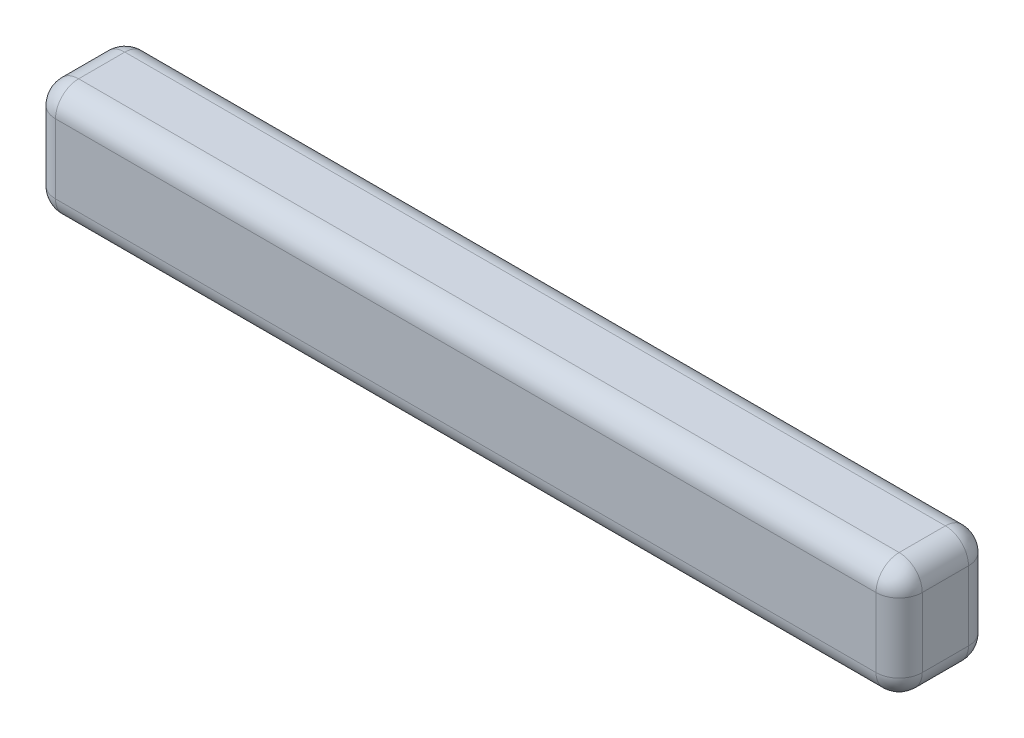
ISO-10303-21;
HEADER;
FILE_DESCRIPTION(('STEP AP214'),'2;1');
FILE_NAME('part.step','',(''),(''),'','','');
FILE_SCHEMA(('AUTOMOTIVE_DESIGN { 1 0 10303 214 1 1 1 1 }'));
ENDSEC;
DATA;
#1=APPLICATION_CONTEXT('core data for automotive mechanical design processes');
#2=APPLICATION_PROTOCOL_DEFINITION('international standard','automotive_design',2000,#1);
#3=PRODUCT_CONTEXT('',#1,'mechanical');
#4=PRODUCT('Part','Part','',(#3));
#5=PRODUCT_RELATED_PRODUCT_CATEGORY('part','',(#4));
#6=PRODUCT_DEFINITION_FORMATION('','',#4);
#7=PRODUCT_DEFINITION_CONTEXT('part definition',#1,'design');
#8=PRODUCT_DEFINITION('design','',#6,#7);
#9=PRODUCT_DEFINITION_SHAPE('','',#8);
#10=(LENGTH_UNIT() NAMED_UNIT(*) SI_UNIT(.MILLI.,.METRE.));
#11=(NAMED_UNIT(*) PLANE_ANGLE_UNIT() SI_UNIT($,.RADIAN.));
#12=(NAMED_UNIT(*) SI_UNIT($,.STERADIAN.) SOLID_ANGLE_UNIT());
#13=UNCERTAINTY_MEASURE_WITH_UNIT(LENGTH_MEASURE(1.E-05),#10,'distance_accuracy_value','');
#14=(GEOMETRIC_REPRESENTATION_CONTEXT(3) GLOBAL_UNCERTAINTY_ASSIGNED_CONTEXT((#13)) GLOBAL_UNIT_ASSIGNED_CONTEXT((#10,
#11,#12)) REPRESENTATION_CONTEXT('',''));
#15=CARTESIAN_POINT('',(0.,0.,0.));
#16=DIRECTION('',(0.,0.,1.));
#17=DIRECTION('',(1.,0.,0.));
#18=AXIS2_PLACEMENT_3D('',#15,#16,#17);
#19=CARTESIAN_POINT('',(18.75,5.,2.));
#20=DIRECTION('',(-1.,0.,0.));
#21=DIRECTION('',(0.,0.,1.));
#22=AXIS2_PLACEMENT_3D('',#19,#20,#21);
#23=PLANE('',#22);
#24=DIRECTION('',(0.,0.,-1.));
#25=VECTOR('',#24,1.);
#26=CARTESIAN_POINT('',(18.75,4.,2.));
#27=LINE('',#26,#25);
#28=CARTESIAN_POINT('',(18.75,4.,-1.));
#29=VERTEX_POINT('',#28);
#30=CARTESIAN_POINT('',(18.75,4.,1.));
#31=VERTEX_POINT('',#30);
#32=EDGE_CURVE('E41',#29,#31,#27,.F.);
#33=ORIENTED_EDGE('',*,*,#32,.T.);
#34=DIRECTION('',(0.,-1.,0.));
#35=VECTOR('',#34,1.);
#36=CARTESIAN_POINT('',(18.75,5.,1.));
#37=LINE('',#36,#35);
#38=CARTESIAN_POINT('',(18.75,1.,1.));
#39=VERTEX_POINT('',#38);
#40=EDGE_CURVE('E11',#31,#39,#37,.T.);
#41=ORIENTED_EDGE('',*,*,#40,.T.);
#42=DIRECTION('',(0.,0.,-1.));
#43=VECTOR('',#42,1.);
#44=CARTESIAN_POINT('',(18.75,1.,-2.));
#45=LINE('',#44,#43);
#46=CARTESIAN_POINT('',(18.75,1.,-1.));
#47=VERTEX_POINT('',#46);
#48=EDGE_CURVE('E193',#39,#47,#45,.T.);
#49=ORIENTED_EDGE('',*,*,#48,.T.);
#50=DIRECTION('',(0.,-1.,0.));
#51=VECTOR('',#50,1.);
#52=CARTESIAN_POINT('',(18.75,5.,-1.));
#53=LINE('',#52,#51);
#54=EDGE_CURVE('E52',#47,#29,#53,.F.);
#55=ORIENTED_EDGE('',*,*,#54,.T.);
#56=EDGE_LOOP('',(#33,#41,#49,#55));
#57=FACE_BOUND('',#56,.T.);
#58=ADVANCED_FACE('F32',(#57),#23,.F.);
#59=CARTESIAN_POINT('',(-18.75,5.,-2.));
#60=DIRECTION('',(0.,0.,1.));
#61=DIRECTION('',(1.,0.,0.));
#62=AXIS2_PLACEMENT_3D('',#59,#60,#61);
#63=PLANE('',#62);
#64=DIRECTION('',(0.,-1.,0.));
#65=VECTOR('',#64,1.);
#66=CARTESIAN_POINT('',(17.75,5.,-2.));
#67=LINE('',#66,#65);
#68=CARTESIAN_POINT('',(17.75,4.,-2.));
#69=VERTEX_POINT('',#68);
#70=CARTESIAN_POINT('',(17.75,1.,-2.));
#71=VERTEX_POINT('',#70);
#72=EDGE_CURVE('E157',#69,#71,#67,.T.);
#73=ORIENTED_EDGE('',*,*,#72,.T.);
#74=DIRECTION('',(-1.,0.,0.));
#75=VECTOR('',#74,1.);
#76=CARTESIAN_POINT('',(-18.75,1.,-2.));
#77=LINE('',#76,#75);
#78=CARTESIAN_POINT('',(-17.75,1.,-2.));
#79=VERTEX_POINT('',#78);
#80=EDGE_CURVE('E164',#71,#79,#77,.T.);
#81=ORIENTED_EDGE('',*,*,#80,.T.);
#82=DIRECTION('',(0.,-1.,0.));
#83=VECTOR('',#82,1.);
#84=CARTESIAN_POINT('',(-17.75,5.,-2.));
#85=LINE('',#84,#83);
#86=CARTESIAN_POINT('',(-17.75,4.,-2.));
#87=VERTEX_POINT('',#86);
#88=EDGE_CURVE('E127',#79,#87,#85,.F.);
#89=ORIENTED_EDGE('',*,*,#88,.T.);
#90=DIRECTION('',(-1.,0.,0.));
#91=VECTOR('',#90,1.);
#92=CARTESIAN_POINT('',(-18.75,4.,-2.));
#93=LINE('',#92,#91);
#94=EDGE_CURVE('E155',#87,#69,#93,.F.);
#95=ORIENTED_EDGE('',*,*,#94,.T.);
#96=EDGE_LOOP('',(#73,#81,#89,#95));
#97=FACE_BOUND('',#96,.T.);
#98=ADVANCED_FACE('F305',(#97),#63,.F.);
#99=CARTESIAN_POINT('',(-18.75,5.,2.));
#100=DIRECTION('',(1.,0.,0.));
#101=DIRECTION('',(0.,0.,-1.));
#102=AXIS2_PLACEMENT_3D('',#99,#100,#101);
#103=PLANE('',#102);
#104=DIRECTION('',(0.,0.,1.));
#105=VECTOR('',#104,1.);
#106=CARTESIAN_POINT('',(-18.75,4.,2.));
#107=LINE('',#106,#105);
#108=CARTESIAN_POINT('',(-18.75,4.,1.));
#109=VERTEX_POINT('',#108);
#110=CARTESIAN_POINT('',(-18.75,4.,-1.));
#111=VERTEX_POINT('',#110);
#112=EDGE_CURVE('E153',#109,#111,#107,.F.);
#113=ORIENTED_EDGE('',*,*,#112,.T.);
#114=DIRECTION('',(0.,-1.,0.));
#115=VECTOR('',#114,1.);
#116=CARTESIAN_POINT('',(-18.75,5.,-1.));
#117=LINE('',#116,#115);
#118=CARTESIAN_POINT('',(-18.75,1.,-1.));
#119=VERTEX_POINT('',#118);
#120=EDGE_CURVE('E125',#111,#119,#117,.T.);
#121=ORIENTED_EDGE('',*,*,#120,.T.);
#122=DIRECTION('',(0.,0.,1.));
#123=VECTOR('',#122,1.);
#124=CARTESIAN_POINT('',(-18.75,1.,2.));
#125=LINE('',#124,#123);
#126=CARTESIAN_POINT('',(-18.75,1.,1.));
#127=VERTEX_POINT('',#126);
#128=EDGE_CURVE('E143',#119,#127,#125,.T.);
#129=ORIENTED_EDGE('',*,*,#128,.T.);
#130=DIRECTION('',(0.,-1.,0.));
#131=VECTOR('',#130,1.);
#132=CARTESIAN_POINT('',(-18.75,5.,1.));
#133=LINE('',#132,#131);
#134=EDGE_CURVE('E149',#127,#109,#133,.F.);
#135=ORIENTED_EDGE('',*,*,#134,.T.);
#136=EDGE_LOOP('',(#113,#121,#129,#135));
#137=FACE_BOUND('',#136,.T.);
#138=ADVANCED_FACE('F151',(#137),#103,.F.);
#139=CARTESIAN_POINT('',(-18.75,5.,2.));
#140=DIRECTION('',(0.,0.,-1.));
#141=DIRECTION('',(-1.,0.,0.));
#142=AXIS2_PLACEMENT_3D('',#139,#140,#141);
#143=PLANE('',#142);
#144=DIRECTION('',(0.,-1.,0.));
#145=VECTOR('',#144,1.);
#146=CARTESIAN_POINT('',(-17.75,5.,2.));
#147=LINE('',#146,#145);
#148=CARTESIAN_POINT('',(-17.75,4.,2.));
#149=VERTEX_POINT('',#148);
#150=CARTESIAN_POINT('',(-17.75,1.,2.));
#151=VERTEX_POINT('',#150);
#152=EDGE_CURVE('E179',#149,#151,#147,.T.);
#153=ORIENTED_EDGE('',*,*,#152,.T.);
#154=DIRECTION('',(1.,0.,0.));
#155=VECTOR('',#154,1.);
#156=CARTESIAN_POINT('',(18.75,1.,2.));
#157=LINE('',#156,#155);
#158=CARTESIAN_POINT('',(17.75,1.,2.));
#159=VERTEX_POINT('',#158);
#160=EDGE_CURVE('E182',#151,#159,#157,.T.);
#161=ORIENTED_EDGE('',*,*,#160,.T.);
#162=DIRECTION('',(0.,-1.,0.));
#163=VECTOR('',#162,1.);
#164=CARTESIAN_POINT('',(17.75,5.,2.));
#165=LINE('',#164,#163);
#166=CARTESIAN_POINT('',(17.75,4.,2.));
#167=VERTEX_POINT('',#166);
#168=EDGE_CURVE('E177',#159,#167,#165,.F.);
#169=ORIENTED_EDGE('',*,*,#168,.T.);
#170=DIRECTION('',(1.,0.,0.));
#171=VECTOR('',#170,1.);
#172=CARTESIAN_POINT('',(-18.75,4.,2.));
#173=LINE('',#172,#171);
#174=EDGE_CURVE('E175',#167,#149,#173,.F.);
#175=ORIENTED_EDGE('',*,*,#174,.T.);
#176=EDGE_LOOP('',(#153,#161,#169,#175));
#177=FACE_BOUND('',#176,.T.);
#178=ADVANCED_FACE('F278',(#177),#143,.F.);
#179=CARTESIAN_POINT('',(0.,5.,0.));
#180=DIRECTION('',(0.,-1.,0.));
#181=DIRECTION('',(0.,0.,-1.));
#182=AXIS2_PLACEMENT_3D('',#179,#180,#181);
#183=PLANE('',#182);
#184=DIRECTION('',(0.,0.,-1.));
#185=VECTOR('',#184,1.);
#186=CARTESIAN_POINT('',(17.75,5.,0.));
#187=LINE('',#186,#185);
#188=CARTESIAN_POINT('',(17.75,5.,1.));
#189=VERTEX_POINT('',#188);
#190=CARTESIAN_POINT('',(17.75,5.,-1.));
#191=VERTEX_POINT('',#190);
#192=EDGE_CURVE('E168',#189,#191,#187,.T.);
#193=ORIENTED_EDGE('',*,*,#192,.T.);
#194=DIRECTION('',(-1.,0.,0.));
#195=VECTOR('',#194,1.);
#196=CARTESIAN_POINT('',(0.,5.,-1.));
#197=LINE('',#196,#195);
#198=CARTESIAN_POINT('',(-17.75,5.,-1.));
#199=VERTEX_POINT('',#198);
#200=EDGE_CURVE('E173',#191,#199,#197,.T.);
#201=ORIENTED_EDGE('',*,*,#200,.T.);
#202=DIRECTION('',(0.,0.,1.));
#203=VECTOR('',#202,1.);
#204=CARTESIAN_POINT('',(-17.75,5.,0.));
#205=LINE('',#204,#203);
#206=CARTESIAN_POINT('',(-17.75,5.,1.));
#207=VERTEX_POINT('',#206);
#208=EDGE_CURVE('E170',#199,#207,#205,.T.);
#209=ORIENTED_EDGE('',*,*,#208,.T.);
#210=DIRECTION('',(1.,0.,0.));
#211=VECTOR('',#210,1.);
#212=CARTESIAN_POINT('',(0.,5.,1.));
#213=LINE('',#212,#211);
#214=EDGE_CURVE('E166',#207,#189,#213,.T.);
#215=ORIENTED_EDGE('',*,*,#214,.T.);
#216=EDGE_LOOP('',(#193,#201,#209,#215));
#217=FACE_BOUND('',#216,.T.);
#218=ADVANCED_FACE('F269',(#217),#183,.F.);
#219=CARTESIAN_POINT('',(0.,0.,0.));
#220=DIRECTION('',(0.,-1.,0.));
#221=DIRECTION('',(0.,0.,-1.));
#222=AXIS2_PLACEMENT_3D('',#219,#220,#221);
#223=PLANE('',#222);
#224=DIRECTION('',(0.,0.,-1.));
#225=VECTOR('',#224,1.);
#226=CARTESIAN_POINT('',(17.75,0.,2.));
#227=LINE('',#226,#225);
#228=CARTESIAN_POINT('',(17.75,0.,-1.));
#229=VERTEX_POINT('',#228);
#230=CARTESIAN_POINT('',(17.75,0.,1.));
#231=VERTEX_POINT('',#230);
#232=EDGE_CURVE('E186',#229,#231,#227,.F.);
#233=ORIENTED_EDGE('',*,*,#232,.T.);
#234=DIRECTION('',(1.,0.,0.));
#235=VECTOR('',#234,1.);
#236=CARTESIAN_POINT('',(-18.75,0.,1.));
#237=LINE('',#236,#235);
#238=CARTESIAN_POINT('',(-17.75,0.,1.));
#239=VERTEX_POINT('',#238);
#240=EDGE_CURVE('E191',#231,#239,#237,.F.);
#241=ORIENTED_EDGE('',*,*,#240,.T.);
#242=DIRECTION('',(0.,0.,1.));
#243=VECTOR('',#242,1.);
#244=CARTESIAN_POINT('',(-17.75,0.,-2.));
#245=LINE('',#244,#243);
#246=CARTESIAN_POINT('',(-17.75,0.,-1.));
#247=VERTEX_POINT('',#246);
#248=EDGE_CURVE('E188',#239,#247,#245,.F.);
#249=ORIENTED_EDGE('',*,*,#248,.T.);
#250=DIRECTION('',(-1.,0.,0.));
#251=VECTOR('',#250,1.);
#252=CARTESIAN_POINT('',(18.75,0.,-1.));
#253=LINE('',#252,#251);
#254=EDGE_CURVE('E184',#247,#229,#253,.F.);
#255=ORIENTED_EDGE('',*,*,#254,.T.);
#256=EDGE_LOOP('',(#233,#241,#249,#255));
#257=FACE_BOUND('',#256,.T.);
#258=ADVANCED_FACE('F476',(#257),#223,.T.);
#259=CARTESIAN_POINT('',(17.75,5.,1.));
#260=DIRECTION('',(0.,-1.,0.));
#261=DIRECTION('',(0.,0.,-1.));
#262=AXIS2_PLACEMENT_3D('',#259,#260,#261);
#263=CYLINDRICAL_SURFACE('',#262,1.);
#264=CARTESIAN_POINT('',(17.75,4.,1.));
#265=DIRECTION('',(0.,1.,0.));
#266=DIRECTION('',(0.,0.,1.));
#267=AXIS2_PLACEMENT_3D('',#264,#265,#266);
#268=CIRCLE('',#267,1.);
#269=EDGE_CURVE('E36',#167,#31,#268,.T.);
#270=ORIENTED_EDGE('',*,*,#269,.F.);
#271=ORIENTED_EDGE('',*,*,#168,.F.);
#272=CARTESIAN_POINT('',(17.75,1.,1.));
#273=DIRECTION('',(0.,-1.,0.));
#274=DIRECTION('',(0.,0.,-1.));
#275=AXIS2_PLACEMENT_3D('',#272,#273,#274);
#276=CIRCLE('',#275,1.);
#277=EDGE_CURVE('E247',#39,#159,#276,.T.);
#278=ORIENTED_EDGE('',*,*,#277,.F.);
#279=ORIENTED_EDGE('',*,*,#40,.F.);
#280=EDGE_LOOP('',(#270,#271,#278,#279));
#281=FACE_BOUND('',#280,.T.);
#282=ADVANCED_FACE('F34',(#281),#263,.T.);
#283=CARTESIAN_POINT('',(17.75,4.,1.));
#284=DIRECTION('',(0.,0.,1.));
#285=DIRECTION('',(1.,0.,0.));
#286=AXIS2_PLACEMENT_3D('',#283,#284,#285);
#287=SPHERICAL_SURFACE('',#286,1.);
#288=CARTESIAN_POINT('',(17.75,4.,1.));
#289=DIRECTION('',(1.,0.,0.));
#290=DIRECTION('',(0.,0.,-1.));
#291=AXIS2_PLACEMENT_3D('',#288,#289,#290);
#292=CIRCLE('',#291,1.);
#293=EDGE_CURVE('E242',#167,#189,#292,.F.);
#294=ORIENTED_EDGE('',*,*,#293,.F.);
#295=ORIENTED_EDGE('',*,*,#269,.T.);
#296=CARTESIAN_POINT('',(17.75,4.,1.));
#297=DIRECTION('',(0.,0.,1.));
#298=DIRECTION('',(1.,0.,0.));
#299=AXIS2_PLACEMENT_3D('',#296,#297,#298);
#300=CIRCLE('',#299,1.);
#301=EDGE_CURVE('E245',#189,#31,#300,.F.);
#302=ORIENTED_EDGE('',*,*,#301,.F.);
#303=EDGE_LOOP('',(#294,#295,#302));
#304=FACE_BOUND('',#303,.T.);
#305=ADVANCED_FACE('F258',(#304),#287,.T.);
#306=CARTESIAN_POINT('',(17.75,1.,1.));
#307=DIRECTION('',(0.,0.,1.));
#308=DIRECTION('',(1.,0.,0.));
#309=AXIS2_PLACEMENT_3D('',#306,#307,#308);
#310=SPHERICAL_SURFACE('',#309,1.);
#311=CARTESIAN_POINT('',(17.75,1.,1.));
#312=DIRECTION('',(0.,0.,1.));
#313=DIRECTION('',(1.,0.,0.));
#314=AXIS2_PLACEMENT_3D('',#311,#312,#313);
#315=CIRCLE('',#314,1.);
#316=EDGE_CURVE('E236',#39,#231,#315,.F.);
#317=ORIENTED_EDGE('',*,*,#316,.F.);
#318=ORIENTED_EDGE('',*,*,#277,.T.);
#319=CARTESIAN_POINT('',(17.75,1.,1.));
#320=DIRECTION('',(1.,0.,0.));
#321=DIRECTION('',(0.,0.,-1.));
#322=AXIS2_PLACEMENT_3D('',#319,#320,#321);
#323=CIRCLE('',#322,1.);
#324=EDGE_CURVE('E239',#231,#159,#323,.F.);
#325=ORIENTED_EDGE('',*,*,#324,.F.);
#326=EDGE_LOOP('',(#317,#318,#325));
#327=FACE_BOUND('',#326,.T.);
#328=ADVANCED_FACE('F455',(#327),#310,.T.);
#329=CARTESIAN_POINT('',(17.75,4.,0.));
#330=DIRECTION('',(0.,0.,-1.));
#331=DIRECTION('',(-1.,0.,0.));
#332=AXIS2_PLACEMENT_3D('',#329,#330,#331);
#333=CYLINDRICAL_SURFACE('',#332,1.);
#334=ORIENTED_EDGE('',*,*,#301,.T.);
#335=ORIENTED_EDGE('',*,*,#32,.F.);
#336=CARTESIAN_POINT('',(17.75,4.,-1.));
#337=DIRECTION('',(0.,0.,-1.));
#338=DIRECTION('',(-1.,0.,0.));
#339=AXIS2_PLACEMENT_3D('',#336,#337,#338);
#340=CIRCLE('',#339,1.);
#341=EDGE_CURVE('E230',#191,#29,#340,.T.);
#342=ORIENTED_EDGE('',*,*,#341,.F.);
#343=ORIENTED_EDGE('',*,*,#192,.F.);
#344=EDGE_LOOP('',(#334,#335,#342,#343));
#345=FACE_BOUND('',#344,.T.);
#346=ADVANCED_FACE('F264',(#345),#333,.T.);
#347=CARTESIAN_POINT('',(0.,4.,1.));
#348=DIRECTION('',(1.,0.,0.));
#349=DIRECTION('',(0.,0.,-1.));
#350=AXIS2_PLACEMENT_3D('',#347,#348,#349);
#351=CYLINDRICAL_SURFACE('',#350,1.);
#352=ORIENTED_EDGE('',*,*,#293,.T.);
#353=ORIENTED_EDGE('',*,*,#214,.F.);
#354=CARTESIAN_POINT('',(-17.75,4.,1.));
#355=DIRECTION('',(-1.,0.,0.));
#356=DIRECTION('',(0.,0.,1.));
#357=AXIS2_PLACEMENT_3D('',#354,#355,#356);
#358=CIRCLE('',#357,1.);
#359=EDGE_CURVE('E227',#149,#207,#358,.T.);
#360=ORIENTED_EDGE('',*,*,#359,.F.);
#361=ORIENTED_EDGE('',*,*,#174,.F.);
#362=EDGE_LOOP('',(#352,#353,#360,#361));
#363=FACE_BOUND('',#362,.T.);
#364=ADVANCED_FACE('F275',(#363),#351,.T.);
#365=CARTESIAN_POINT('',(-17.75,5.,1.));
#366=DIRECTION('',(0.,-1.,0.));
#367=DIRECTION('',(0.,0.,-1.));
#368=AXIS2_PLACEMENT_3D('',#365,#366,#367);
#369=CYLINDRICAL_SURFACE('',#368,1.);
#370=CARTESIAN_POINT('',(-17.75,1.,1.));
#371=DIRECTION('',(0.,-1.,0.));
#372=DIRECTION('',(0.,0.,-1.));
#373=AXIS2_PLACEMENT_3D('',#370,#371,#372);
#374=CIRCLE('',#373,1.);
#375=EDGE_CURVE('E221',#151,#127,#374,.T.);
#376=ORIENTED_EDGE('',*,*,#375,.F.);
#377=ORIENTED_EDGE('',*,*,#152,.F.);
#378=CARTESIAN_POINT('',(-17.75,4.,1.));
#379=DIRECTION('',(0.,1.,0.));
#380=DIRECTION('',(0.,0.,1.));
#381=AXIS2_PLACEMENT_3D('',#378,#379,#380);
#382=CIRCLE('',#381,1.);
#383=EDGE_CURVE('E224',#109,#149,#382,.T.);
#384=ORIENTED_EDGE('',*,*,#383,.F.);
#385=ORIENTED_EDGE('',*,*,#134,.F.);
#386=EDGE_LOOP('',(#376,#377,#384,#385));
#387=FACE_BOUND('',#386,.T.);
#388=ADVANCED_FACE('F282',(#387),#369,.T.);
#389=CARTESIAN_POINT('',(-18.75,1.,1.));
#390=DIRECTION('',(-1.,0.,0.));
#391=DIRECTION('',(0.,0.,1.));
#392=AXIS2_PLACEMENT_3D('',#389,#390,#391);
#393=CYLINDRICAL_SURFACE('',#392,1.);
#394=ORIENTED_EDGE('',*,*,#324,.T.);
#395=ORIENTED_EDGE('',*,*,#160,.F.);
#396=CARTESIAN_POINT('',(-17.75,1.,1.));
#397=DIRECTION('',(-1.,0.,0.));
#398=DIRECTION('',(0.,0.,1.));
#399=AXIS2_PLACEMENT_3D('',#396,#397,#398);
#400=CIRCLE('',#399,1.);
#401=EDGE_CURVE('E219',#239,#151,#400,.T.);
#402=ORIENTED_EDGE('',*,*,#401,.F.);
#403=ORIENTED_EDGE('',*,*,#240,.F.);
#404=EDGE_LOOP('',(#394,#395,#402,#403));
#405=FACE_BOUND('',#404,.T.);
#406=ADVANCED_FACE('F288',(#405),#393,.T.);
#407=CARTESIAN_POINT('',(17.75,1.,2.));
#408=DIRECTION('',(0.,0.,1.));
#409=DIRECTION('',(1.,0.,0.));
#410=AXIS2_PLACEMENT_3D('',#407,#408,#409);
#411=CYLINDRICAL_SURFACE('',#410,1.);
#412=ORIENTED_EDGE('',*,*,#316,.T.);
#413=ORIENTED_EDGE('',*,*,#232,.F.);
#414=CARTESIAN_POINT('',(17.75,1.,-1.));
#415=DIRECTION('',(0.,0.,-1.));
#416=DIRECTION('',(-1.,0.,0.));
#417=AXIS2_PLACEMENT_3D('',#414,#415,#416);
#418=CIRCLE('',#417,1.);
#419=EDGE_CURVE('E216',#47,#229,#418,.T.);
#420=ORIENTED_EDGE('',*,*,#419,.F.);
#421=ORIENTED_EDGE('',*,*,#48,.F.);
#422=EDGE_LOOP('',(#412,#413,#420,#421));
#423=FACE_BOUND('',#422,.T.);
#424=ADVANCED_FACE('F298',(#423),#411,.T.);
#425=CARTESIAN_POINT('',(17.75,5.,-1.));
#426=DIRECTION('',(0.,-1.,0.));
#427=DIRECTION('',(0.,0.,-1.));
#428=AXIS2_PLACEMENT_3D('',#425,#426,#427);
#429=CYLINDRICAL_SURFACE('',#428,1.);
#430=CARTESIAN_POINT('',(17.75,4.,-1.));
#431=DIRECTION('',(0.,1.,0.));
#432=DIRECTION('',(0.,0.,1.));
#433=AXIS2_PLACEMENT_3D('',#430,#431,#432);
#434=CIRCLE('',#433,1.);
#435=EDGE_CURVE('E233',#29,#69,#434,.T.);
#436=ORIENTED_EDGE('',*,*,#435,.F.);
#437=ORIENTED_EDGE('',*,*,#54,.F.);
#438=CARTESIAN_POINT('',(17.75,1.,-1.));
#439=DIRECTION('',(0.,-1.,0.));
#440=DIRECTION('',(0.,0.,-1.));
#441=AXIS2_PLACEMENT_3D('',#438,#439,#440);
#442=CIRCLE('',#441,1.);
#443=EDGE_CURVE('E213',#71,#47,#442,.T.);
#444=ORIENTED_EDGE('',*,*,#443,.F.);
#445=ORIENTED_EDGE('',*,*,#72,.F.);
#446=EDGE_LOOP('',(#436,#437,#444,#445));
#447=FACE_BOUND('',#446,.T.);
#448=ADVANCED_FACE('F294',(#447),#429,.T.);
#449=CARTESIAN_POINT('',(17.75,4.,-1.));
#450=DIRECTION('',(0.,0.,1.));
#451=DIRECTION('',(1.,0.,0.));
#452=AXIS2_PLACEMENT_3D('',#449,#450,#451);
#453=SPHERICAL_SURFACE('',#452,1.);
#454=ORIENTED_EDGE('',*,*,#341,.T.);
#455=ORIENTED_EDGE('',*,*,#435,.T.);
#456=CARTESIAN_POINT('',(17.75,4.,-1.));
#457=DIRECTION('',(1.,0.,0.));
#458=DIRECTION('',(0.,0.,-1.));
#459=AXIS2_PLACEMENT_3D('',#456,#457,#458);
#460=CIRCLE('',#459,1.);
#461=EDGE_CURVE('E210',#191,#69,#460,.F.);
#462=ORIENTED_EDGE('',*,*,#461,.F.);
#463=EDGE_LOOP('',(#454,#455,#462));
#464=FACE_BOUND('',#463,.T.);
#465=ADVANCED_FACE('F308',(#464),#453,.T.);
#466=CARTESIAN_POINT('',(-17.75,4.,1.));
#467=DIRECTION('',(0.,0.,1.));
#468=DIRECTION('',(1.,0.,0.));
#469=AXIS2_PLACEMENT_3D('',#466,#467,#468);
#470=SPHERICAL_SURFACE('',#469,1.);
#471=ORIENTED_EDGE('',*,*,#383,.T.);
#472=ORIENTED_EDGE('',*,*,#359,.T.);
#473=CARTESIAN_POINT('',(-17.75,4.,1.));
#474=DIRECTION('',(0.,0.,1.));
#475=DIRECTION('',(1.,0.,0.));
#476=AXIS2_PLACEMENT_3D('',#473,#474,#475);
#477=CIRCLE('',#476,1.);
#478=EDGE_CURVE('E208',#109,#207,#477,.F.);
#479=ORIENTED_EDGE('',*,*,#478,.F.);
#480=EDGE_LOOP('',(#471,#472,#479));
#481=FACE_BOUND('',#480,.T.);
#482=ADVANCED_FACE('F318',(#481),#470,.T.);
#483=CARTESIAN_POINT('',(-17.75,1.,1.));
#484=DIRECTION('',(0.,0.,1.));
#485=DIRECTION('',(1.,0.,0.));
#486=AXIS2_PLACEMENT_3D('',#483,#484,#485);
#487=SPHERICAL_SURFACE('',#486,1.);
#488=ORIENTED_EDGE('',*,*,#401,.T.);
#489=ORIENTED_EDGE('',*,*,#375,.T.);
#490=CARTESIAN_POINT('',(-17.75,1.,1.));
#491=DIRECTION('',(0.,0.,1.));
#492=DIRECTION('',(1.,0.,0.));
#493=AXIS2_PLACEMENT_3D('',#490,#491,#492);
#494=CIRCLE('',#493,1.);
#495=EDGE_CURVE('E146',#239,#127,#494,.F.);
#496=ORIENTED_EDGE('',*,*,#495,.F.);
#497=EDGE_LOOP('',(#488,#489,#496));
#498=FACE_BOUND('',#497,.T.);
#499=ADVANCED_FACE('F320',(#498),#487,.T.);
#500=CARTESIAN_POINT('',(17.75,1.,-1.));
#501=DIRECTION('',(0.,0.,1.));
#502=DIRECTION('',(1.,0.,0.));
#503=AXIS2_PLACEMENT_3D('',#500,#501,#502);
#504=SPHERICAL_SURFACE('',#503,1.);
#505=ORIENTED_EDGE('',*,*,#443,.T.);
#506=ORIENTED_EDGE('',*,*,#419,.T.);
#507=CARTESIAN_POINT('',(17.75,1.,-1.));
#508=DIRECTION('',(1.,0.,0.));
#509=DIRECTION('',(0.,0.,-1.));
#510=AXIS2_PLACEMENT_3D('',#507,#508,#509);
#511=CIRCLE('',#510,1.);
#512=EDGE_CURVE('E204',#71,#229,#511,.F.);
#513=ORIENTED_EDGE('',*,*,#512,.F.);
#514=EDGE_LOOP('',(#505,#506,#513));
#515=FACE_BOUND('',#514,.T.);
#516=ADVANCED_FACE('F300',(#515),#504,.T.);
#517=CARTESIAN_POINT('',(0.,4.,-1.));
#518=DIRECTION('',(-1.,0.,0.));
#519=DIRECTION('',(0.,0.,1.));
#520=AXIS2_PLACEMENT_3D('',#517,#518,#519);
#521=CYLINDRICAL_SURFACE('',#520,1.);
#522=ORIENTED_EDGE('',*,*,#461,.T.);
#523=ORIENTED_EDGE('',*,*,#94,.F.);
#524=CARTESIAN_POINT('',(-17.75,4.,-1.));
#525=DIRECTION('',(-1.,0.,0.));
#526=DIRECTION('',(0.,0.,1.));
#527=AXIS2_PLACEMENT_3D('',#524,#525,#526);
#528=CIRCLE('',#527,1.);
#529=EDGE_CURVE('E201',#199,#87,#528,.T.);
#530=ORIENTED_EDGE('',*,*,#529,.F.);
#531=ORIENTED_EDGE('',*,*,#200,.F.);
#532=EDGE_LOOP('',(#522,#523,#530,#531));
#533=FACE_BOUND('',#532,.T.);
#534=ADVANCED_FACE('F310',(#533),#521,.T.);
#535=CARTESIAN_POINT('',(-17.75,4.,0.));
#536=DIRECTION('',(0.,0.,1.));
#537=DIRECTION('',(1.,0.,0.));
#538=AXIS2_PLACEMENT_3D('',#535,#536,#537);
#539=CYLINDRICAL_SURFACE('',#538,1.);
#540=ORIENTED_EDGE('',*,*,#478,.T.);
#541=ORIENTED_EDGE('',*,*,#208,.F.);
#542=CARTESIAN_POINT('',(-17.75,4.,-1.));
#543=DIRECTION('',(0.,0.,-1.));
#544=DIRECTION('',(-1.,0.,0.));
#545=AXIS2_PLACEMENT_3D('',#542,#543,#544);
#546=CIRCLE('',#545,1.);
#547=EDGE_CURVE('E140',#111,#199,#546,.T.);
#548=ORIENTED_EDGE('',*,*,#547,.F.);
#549=ORIENTED_EDGE('',*,*,#112,.F.);
#550=EDGE_LOOP('',(#540,#541,#548,#549));
#551=FACE_BOUND('',#550,.T.);
#552=ADVANCED_FACE('F316',(#551),#539,.T.);
#553=CARTESIAN_POINT('',(-17.75,1.,2.));
#554=DIRECTION('',(0.,0.,-1.));
#555=DIRECTION('',(-1.,0.,0.));
#556=AXIS2_PLACEMENT_3D('',#553,#554,#555);
#557=CYLINDRICAL_SURFACE('',#556,1.);
#558=ORIENTED_EDGE('',*,*,#495,.T.);
#559=ORIENTED_EDGE('',*,*,#128,.F.);
#560=CARTESIAN_POINT('',(-17.75,1.,-1.));
#561=DIRECTION('',(0.,0.,-1.));
#562=DIRECTION('',(-1.,0.,0.));
#563=AXIS2_PLACEMENT_3D('',#560,#561,#562);
#564=CIRCLE('',#563,1.);
#565=EDGE_CURVE('E132',#247,#119,#564,.T.);
#566=ORIENTED_EDGE('',*,*,#565,.F.);
#567=ORIENTED_EDGE('',*,*,#248,.F.);
#568=EDGE_LOOP('',(#558,#559,#566,#567));
#569=FACE_BOUND('',#568,.T.);
#570=ADVANCED_FACE('F144',(#569),#557,.T.);
#571=CARTESIAN_POINT('',(-18.75,1.,-1.));
#572=DIRECTION('',(1.,0.,0.));
#573=DIRECTION('',(0.,0.,-1.));
#574=AXIS2_PLACEMENT_3D('',#571,#572,#573);
#575=CYLINDRICAL_SURFACE('',#574,1.);
#576=ORIENTED_EDGE('',*,*,#512,.T.);
#577=ORIENTED_EDGE('',*,*,#254,.F.);
#578=CARTESIAN_POINT('',(-17.75,1.,-1.));
#579=DIRECTION('',(-1.,0.,0.));
#580=DIRECTION('',(0.,0.,1.));
#581=AXIS2_PLACEMENT_3D('',#578,#579,#580);
#582=CIRCLE('',#581,1.);
#583=EDGE_CURVE('E136',#79,#247,#582,.T.);
#584=ORIENTED_EDGE('',*,*,#583,.F.);
#585=ORIENTED_EDGE('',*,*,#80,.F.);
#586=EDGE_LOOP('',(#576,#577,#584,#585));
#587=FACE_BOUND('',#586,.T.);
#588=ADVANCED_FACE('F303',(#587),#575,.T.);
#589=CARTESIAN_POINT('',(-17.75,4.,-1.));
#590=DIRECTION('',(0.,0.,1.));
#591=DIRECTION('',(1.,0.,0.));
#592=AXIS2_PLACEMENT_3D('',#589,#590,#591);
#593=SPHERICAL_SURFACE('',#592,1.);
#594=ORIENTED_EDGE('',*,*,#547,.T.);
#595=ORIENTED_EDGE('',*,*,#529,.T.);
#596=CARTESIAN_POINT('',(-17.75,4.,-1.));
#597=DIRECTION('',(0.,1.,0.));
#598=DIRECTION('',(0.,0.,1.));
#599=AXIS2_PLACEMENT_3D('',#596,#597,#598);
#600=CIRCLE('',#599,1.);
#601=EDGE_CURVE('E129',#111,#87,#600,.F.);
#602=ORIENTED_EDGE('',*,*,#601,.F.);
#603=EDGE_LOOP('',(#594,#595,#602));
#604=FACE_BOUND('',#603,.T.);
#605=ADVANCED_FACE('F314',(#604),#593,.T.);
#606=CARTESIAN_POINT('',(-17.75,1.,-1.));
#607=DIRECTION('',(0.,0.,1.));
#608=DIRECTION('',(1.,0.,0.));
#609=AXIS2_PLACEMENT_3D('',#606,#607,#608);
#610=SPHERICAL_SURFACE('',#609,1.);
#611=ORIENTED_EDGE('',*,*,#583,.T.);
#612=ORIENTED_EDGE('',*,*,#565,.T.);
#613=CARTESIAN_POINT('',(-17.75,1.,-1.));
#614=DIRECTION('',(0.,-1.,0.));
#615=DIRECTION('',(0.,0.,-1.));
#616=AXIS2_PLACEMENT_3D('',#613,#614,#615);
#617=CIRCLE('',#616,1.);
#618=EDGE_CURVE('E121',#79,#119,#617,.F.);
#619=ORIENTED_EDGE('',*,*,#618,.F.);
#620=EDGE_LOOP('',(#611,#612,#619));
#621=FACE_BOUND('',#620,.T.);
#622=ADVANCED_FACE('F134',(#621),#610,.T.);
#623=CARTESIAN_POINT('',(-17.75,5.,-1.));
#624=DIRECTION('',(0.,-1.,0.));
#625=DIRECTION('',(0.,0.,-1.));
#626=AXIS2_PLACEMENT_3D('',#623,#624,#625);
#627=CYLINDRICAL_SURFACE('',#626,1.);
#628=ORIENTED_EDGE('',*,*,#601,.T.);
#629=ORIENTED_EDGE('',*,*,#88,.F.);
#630=ORIENTED_EDGE('',*,*,#618,.T.);
#631=ORIENTED_EDGE('',*,*,#120,.F.);
#632=EDGE_LOOP('',(#628,#629,#630,#631));
#633=FACE_BOUND('',#632,.T.);
#634=ADVANCED_FACE('F123',(#633),#627,.T.);
#635=CLOSED_SHELL('',(#58,#98,#138,#178,#218,#258,#282,#305,#328,#346,#364,#388,#406,#424,#448,
#465,#482,#499,#516,#534,#552,#570,#588,#605,#622,#634));
#636=MANIFOLD_SOLID_BREP('B2',#635);
#637=ADVANCED_BREP_SHAPE_REPRESENTATION('',(#18,#636),#14);
#638=SHAPE_DEFINITION_REPRESENTATION(#9,#637);
ENDSEC;
END-ISO-10303-21;
